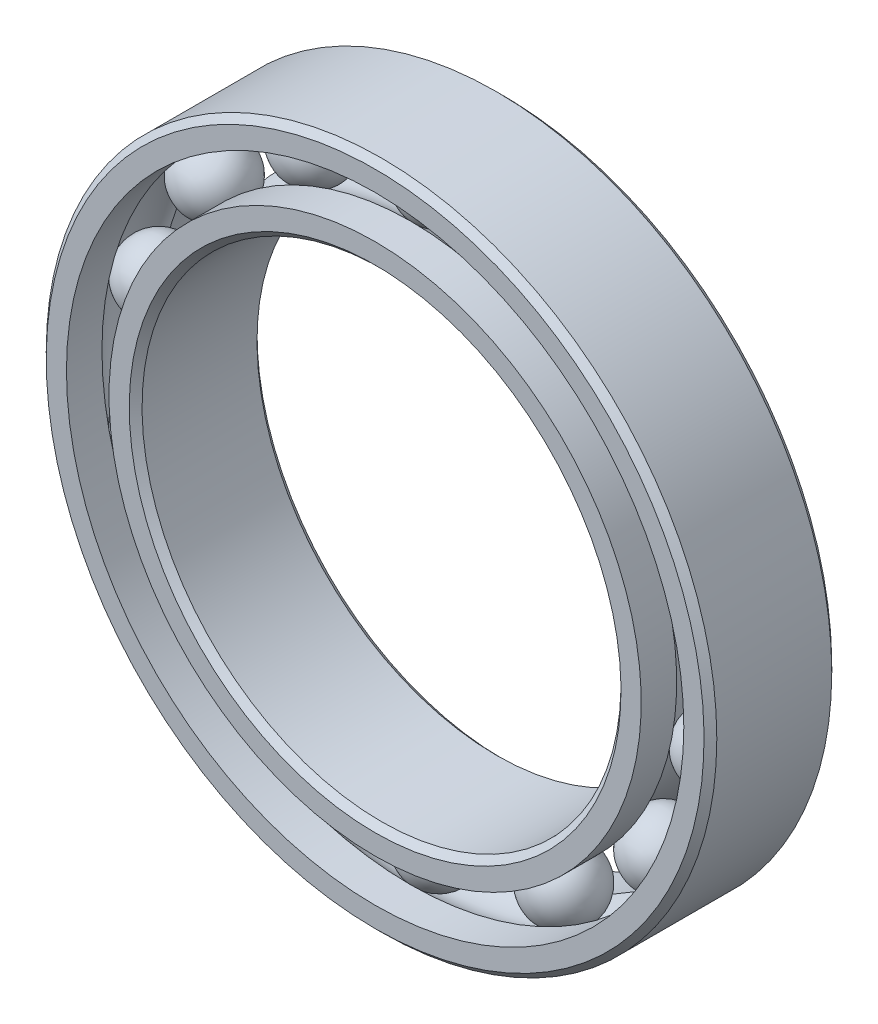
ISO-10303-21;
HEADER;
FILE_DESCRIPTION(('STEP AP214'),'2;1');
FILE_NAME('part.step','',(''),(''),'','','');
FILE_SCHEMA(('AUTOMOTIVE_DESIGN { 1 0 10303 214 1 1 1 1 }'));
ENDSEC;
DATA;
#1=APPLICATION_CONTEXT('core data for automotive mechanical design processes');
#2=APPLICATION_PROTOCOL_DEFINITION('international standard','automotive_design',2000,#1);
#3=PRODUCT_CONTEXT('',#1,'mechanical');
#4=PRODUCT('Part','Part','',(#3));
#5=PRODUCT_RELATED_PRODUCT_CATEGORY('part','',(#4));
#6=PRODUCT_DEFINITION_FORMATION('','',#4);
#7=PRODUCT_DEFINITION_CONTEXT('part definition',#1,'design');
#8=PRODUCT_DEFINITION('design','',#6,#7);
#9=PRODUCT_DEFINITION_SHAPE('','',#8);
#10=(LENGTH_UNIT() NAMED_UNIT(*) SI_UNIT(.MILLI.,.METRE.));
#11=(NAMED_UNIT(*) PLANE_ANGLE_UNIT() SI_UNIT($,.RADIAN.));
#12=(NAMED_UNIT(*) SI_UNIT($,.STERADIAN.) SOLID_ANGLE_UNIT());
#13=UNCERTAINTY_MEASURE_WITH_UNIT(LENGTH_MEASURE(1.E-05),#10,'distance_accuracy_value','');
#14=(GEOMETRIC_REPRESENTATION_CONTEXT(3) GLOBAL_UNCERTAINTY_ASSIGNED_CONTEXT((#13)) GLOBAL_UNIT_ASSIGNED_CONTEXT((#10,
#11,#12)) REPRESENTATION_CONTEXT('',''));
#15=CARTESIAN_POINT('',(0.,0.,0.));
#16=DIRECTION('',(0.,0.,1.));
#17=DIRECTION('',(1.,0.,0.));
#18=AXIS2_PLACEMENT_3D('',#15,#16,#17);
#19=CARTESIAN_POINT('',(3.90495365205792,8.10871981112182,0.));
#20=DIRECTION('',(0.,0.,1.));
#21=DIRECTION('',(0.433883739117546,0.900968867902425,0.));
#22=AXIS2_PLACEMENT_3D('',#19,#20,#21);
#23=SPHERICAL_SURFACE('',#22,1.11111111111111);
#24=CARTESIAN_POINT('',(3.90495365205792,8.10871981112182,1.11111111111111));
#25=VERTEX_POINT('',#24);
#26=VERTEX_LOOP('',#25);
#27=FACE_BOUND('',#26,.T.);
#28=ADVANCED_FACE('F48',(#27),#23,.T.);
#29=CLOSED_SHELL('',(#28));
#30=MANIFOLD_SOLID_BREP('B2',#29);
#31=CARTESIAN_POINT('',(7.0364833422122,5.61140821672869,0.));
#32=DIRECTION('',(0.,0.,1.));
#33=DIRECTION('',(0.781831482468022,0.623489801858743,0.));
#34=AXIS2_PLACEMENT_3D('',#31,#32,#33);
#35=SPHERICAL_SURFACE('',#34,1.11111111111111);
#36=CARTESIAN_POINT('',(7.0364833422122,5.61140821672869,1.11111111111111));
#37=VERTEX_POINT('',#36);
#38=VERTEX_LOOP('',#37);
#39=FACE_BOUND('',#38,.T.);
#40=ADVANCED_FACE('F67',(#39),#35,.T.);
#41=CLOSED_SHELL('',(#40));
#42=MANIFOLD_SOLID_BREP('B6',#41);
#43=CARTESIAN_POINT('',(8.77435120963639,2.00268840560692,0.));
#44=DIRECTION('',(0.,0.,1.));
#45=DIRECTION('',(0.974927912181821,0.222520933956325,0.));
#46=AXIS2_PLACEMENT_3D('',#43,#44,#45);
#47=SPHERICAL_SURFACE('',#46,1.11111111111111);
#48=CARTESIAN_POINT('',(8.77435120963639,2.00268840560692,1.11111111111111));
#49=VERTEX_POINT('',#48);
#50=VERTEX_LOOP('',#49);
#51=FACE_BOUND('',#50,.T.);
#52=ADVANCED_FACE('F86',(#51),#47,.T.);
#53=CLOSED_SHELL('',(#52));
#54=MANIFOLD_SOLID_BREP('B44',#53);
#55=CARTESIAN_POINT('',(8.77435120963643,-2.00268840560675,0.));
#56=DIRECTION('',(0.,0.,1.));
#57=DIRECTION('',(0.974927912181826,-0.222520933956305,0.));
#58=AXIS2_PLACEMENT_3D('',#55,#56,#57);
#59=SPHERICAL_SURFACE('',#58,1.11111111111111);
#60=CARTESIAN_POINT('',(8.77435120963643,-2.00268840560675,1.11111111111111));
#61=VERTEX_POINT('',#60);
#62=VERTEX_LOOP('',#61);
#63=FACE_BOUND('',#62,.T.);
#64=ADVANCED_FACE('F105',(#63),#59,.T.);
#65=CLOSED_SHELL('',(#64));
#66=MANIFOLD_SOLID_BREP('B63',#65);
#67=CARTESIAN_POINT('',(7.03648334221232,-5.61140821672854,0.));
#68=DIRECTION('',(0.,0.,1.));
#69=DIRECTION('',(0.781831482468035,-0.623489801858727,0.));
#70=AXIS2_PLACEMENT_3D('',#67,#68,#69);
#71=SPHERICAL_SURFACE('',#70,1.11111111111111);
#72=CARTESIAN_POINT('',(7.03648334221232,-5.61140821672854,1.11111111111111));
#73=VERTEX_POINT('',#72);
#74=VERTEX_LOOP('',#73);
#75=FACE_BOUND('',#74,.T.);
#76=ADVANCED_FACE('F124',(#75),#71,.T.);
#77=CLOSED_SHELL('',(#76));
#78=MANIFOLD_SOLID_BREP('B82',#77);
#79=CARTESIAN_POINT('',(3.90495365205809,-8.10871981112174,0.));
#80=DIRECTION('',(0.,0.,1.));
#81=DIRECTION('',(0.433883739117565,-0.900968867902416,0.));
#82=AXIS2_PLACEMENT_3D('',#79,#80,#81);
#83=SPHERICAL_SURFACE('',#82,1.11111111111111);
#84=CARTESIAN_POINT('',(3.90495365205809,-8.10871981112174,1.1111111111111));
#85=VERTEX_POINT('',#84);
#86=VERTEX_LOOP('',#85);
#87=FACE_BOUND('',#86,.T.);
#88=ADVANCED_FACE('F143',(#87),#83,.T.);
#89=CLOSED_SHELL('',(#88));
#90=MANIFOLD_SOLID_BREP('B101',#89);
#91=CARTESIAN_POINT('',(0.,-9.,0.));
#92=DIRECTION('',(0.,0.,1.));
#93=DIRECTION('',(0.,-1.,0.));
#94=AXIS2_PLACEMENT_3D('',#91,#92,#93);
#95=SPHERICAL_SURFACE('',#94,1.11111111111111);
#96=CARTESIAN_POINT('',(0.,-9.,1.1111111111111));
#97=VERTEX_POINT('',#96);
#98=VERTEX_LOOP('',#97);
#99=FACE_BOUND('',#98,.T.);
#100=ADVANCED_FACE('F162',(#99),#95,.T.);
#101=CLOSED_SHELL('',(#100));
#102=MANIFOLD_SOLID_BREP('B120',#101);
#103=CARTESIAN_POINT('',(-3.90495365205797,-8.1087198111218,0.));
#104=DIRECTION('',(0.,0.,1.));
#105=DIRECTION('',(-0.433883739117553,-0.900968867902422,0.));
#106=AXIS2_PLACEMENT_3D('',#103,#104,#105);
#107=SPHERICAL_SURFACE('',#106,1.11111111111111);
#108=CARTESIAN_POINT('',(-3.90495365205797,-8.1087198111218,1.1111111111111));
#109=VERTEX_POINT('',#108);
#110=VERTEX_LOOP('',#109);
#111=FACE_BOUND('',#110,.T.);
#112=ADVANCED_FACE('F181',(#111),#107,.T.);
#113=CLOSED_SHELL('',(#112));
#114=MANIFOLD_SOLID_BREP('B139',#113);
#115=CARTESIAN_POINT('',(-7.03648334221224,-5.61140821672864,0.));
#116=DIRECTION('',(0.,0.,1.));
#117=DIRECTION('',(-0.781831482468027,-0.623489801858737,0.));
#118=AXIS2_PLACEMENT_3D('',#115,#116,#117);
#119=SPHERICAL_SURFACE('',#118,1.11111111111111);
#120=CARTESIAN_POINT('',(-7.03648334221224,-5.61140821672864,1.11111111111111));
#121=VERTEX_POINT('',#120);
#122=VERTEX_LOOP('',#121);
#123=FACE_BOUND('',#122,.T.);
#124=ADVANCED_FACE('F200',(#123),#119,.T.);
#125=CLOSED_SHELL('',(#124));
#126=MANIFOLD_SOLID_BREP('B158',#125);
#127=CARTESIAN_POINT('',(-8.77435120963641,-2.00268840560686,0.));
#128=DIRECTION('',(0.,0.,1.));
#129=DIRECTION('',(-0.974927912181823,-0.222520933956318,0.));
#130=AXIS2_PLACEMENT_3D('',#127,#128,#129);
#131=SPHERICAL_SURFACE('',#130,1.11111111111111);
#132=CARTESIAN_POINT('',(-8.77435120963641,-2.00268840560686,1.11111111111111));
#133=VERTEX_POINT('',#132);
#134=VERTEX_LOOP('',#133);
#135=FACE_BOUND('',#134,.T.);
#136=ADVANCED_FACE('F219',(#135),#131,.T.);
#137=CLOSED_SHELL('',(#136));
#138=MANIFOLD_SOLID_BREP('B177',#137);
#139=CARTESIAN_POINT('',(-8.77435120963642,2.0026884056068,0.));
#140=DIRECTION('',(0.,0.,1.));
#141=DIRECTION('',(-0.974927912181824,0.222520933956311,0.));
#142=AXIS2_PLACEMENT_3D('',#139,#140,#141);
#143=SPHERICAL_SURFACE('',#142,1.11111111111111);
#144=CARTESIAN_POINT('',(-8.77435120963642,2.0026884056068,1.11111111111111));
#145=VERTEX_POINT('',#144);
#146=VERTEX_LOOP('',#145);
#147=FACE_BOUND('',#146,.T.);
#148=ADVANCED_FACE('F238',(#147),#143,.T.);
#149=CLOSED_SHELL('',(#148));
#150=MANIFOLD_SOLID_BREP('B196',#149);
#151=CARTESIAN_POINT('',(-7.03648334221228,5.61140821672859,0.));
#152=DIRECTION('',(0.,0.,1.));
#153=DIRECTION('',(-0.781831482468031,0.623489801858732,0.));
#154=AXIS2_PLACEMENT_3D('',#151,#152,#153);
#155=SPHERICAL_SURFACE('',#154,1.11111111111111);
#156=CARTESIAN_POINT('',(-7.03648334221228,5.61140821672859,1.11111111111111));
#157=VERTEX_POINT('',#156);
#158=VERTEX_LOOP('',#157);
#159=FACE_BOUND('',#158,.T.);
#160=ADVANCED_FACE('F257',(#159),#155,.T.);
#161=CLOSED_SHELL('',(#160));
#162=MANIFOLD_SOLID_BREP('B215',#161);
#163=CARTESIAN_POINT('',(-3.90495365205803,8.10871981112177,0.));
#164=DIRECTION('',(0.,0.,1.));
#165=DIRECTION('',(-0.433883739117559,0.900968867902419,0.));
#166=AXIS2_PLACEMENT_3D('',#163,#164,#165);
#167=SPHERICAL_SURFACE('',#166,1.11111111111111);
#168=CARTESIAN_POINT('',(-3.90495365205803,8.10871981112177,1.11111111111111));
#169=VERTEX_POINT('',#168);
#170=VERTEX_LOOP('',#169);
#171=FACE_BOUND('',#170,.T.);
#172=ADVANCED_FACE('F276',(#171),#167,.T.);
#173=CLOSED_SHELL('',(#172));
#174=MANIFOLD_SOLID_BREP('B234',#173);
#175=CARTESIAN_POINT('',(0.,9.,0.));
#176=DIRECTION('',(0.,0.,1.));
#177=DIRECTION('',(0.,1.,0.));
#178=AXIS2_PLACEMENT_3D('',#175,#176,#177);
#179=SPHERICAL_SURFACE('',#178,1.11111111111111);
#180=CARTESIAN_POINT('',(0.,9.,1.11111111111111));
#181=VERTEX_POINT('',#180);
#182=VERTEX_LOOP('',#181);
#183=FACE_BOUND('',#182,.T.);
#184=ADVANCED_FACE('F297',(#183),#179,.T.);
#185=CLOSED_SHELL('',(#184));
#186=MANIFOLD_SOLID_BREP('B253',#185);
#187=CARTESIAN_POINT('',(0.,8.33333333333335,2.));
#188=DIRECTION('',(0.,0.,-1.));
#189=DIRECTION('',(0.,1.,0.));
#190=AXIS2_PLACEMENT_3D('',#187,#188,#189);
#191=PLANE('',#190);
#192=CARTESIAN_POINT('',(0.,0.,2.));
#193=DIRECTION('',(0.,0.,1.));
#194=DIRECTION('',(0.,-1.,0.));
#195=AXIS2_PLACEMENT_3D('',#192,#193,#194);
#196=CIRCLE('',#195,7.7);
#197=CARTESIAN_POINT('',(0.,-7.7,2.));
#198=VERTEX_POINT('',#197);
#199=EDGE_CURVE('E354',#198,#198,#196,.T.);
#200=ORIENTED_EDGE('',*,*,#199,.F.);
#201=EDGE_LOOP('',(#200));
#202=FACE_BOUND('',#201,.T.);
#203=CARTESIAN_POINT('',(0.,0.,2.));
#204=DIRECTION('',(0.,0.,1.));
#205=DIRECTION('',(0.,-1.,0.));
#206=AXIS2_PLACEMENT_3D('',#203,#204,#205);
#207=CIRCLE('',#206,8.33333333333335);
#208=CARTESIAN_POINT('',(0.,-8.33333333333335,2.));
#209=VERTEX_POINT('',#208);
#210=EDGE_CURVE('E296',#209,#209,#207,.T.);
#211=ORIENTED_EDGE('',*,*,#210,.T.);
#212=EDGE_LOOP('',(#211));
#213=FACE_BOUND('',#212,.T.);
#214=ADVANCED_FACE('F317',(#202,#213),#191,.F.);
#215=CARTESIAN_POINT('',(0.,0.,1.99999999999999));
#216=DIRECTION('',(0.,0.,1.));
#217=DIRECTION('',(0.,-1.,0.));
#218=AXIS2_PLACEMENT_3D('',#215,#216,#217);
#219=CYLINDRICAL_SURFACE('',#218,8.33333333333335);
#220=ORIENTED_EDGE('',*,*,#210,.F.);
#221=EDGE_LOOP('',(#220));
#222=FACE_BOUND('',#221,.T.);
#223=CARTESIAN_POINT('',(0.,0.,0.888888888888882));
#224=DIRECTION('',(0.,0.,1.));
#225=DIRECTION('',(0.,-1.,0.));
#226=AXIS2_PLACEMENT_3D('',#223,#224,#225);
#227=CIRCLE('',#226,8.33333333333335);
#228=CARTESIAN_POINT('',(0.,-8.33333333333335,0.888888888888881));
#229=VERTEX_POINT('',#228);
#230=EDGE_CURVE('E324',#229,#229,#227,.T.);
#231=ORIENTED_EDGE('',*,*,#230,.T.);
#232=EDGE_LOOP('',(#231));
#233=FACE_BOUND('',#232,.T.);
#234=ADVANCED_FACE('F363',(#222,#233),#219,.T.);
#235=CARTESIAN_POINT('',(0.,0.,0.));
#236=DIRECTION('',(0.,0.,1.));
#237=DIRECTION('',(0.,-1.,0.));
#238=AXIS2_PLACEMENT_3D('',#235,#236,#237);
#239=TOROIDAL_SURFACE('',#238,9.00000000000003,1.11111111111111);
#240=ORIENTED_EDGE('',*,*,#230,.F.);
#241=EDGE_LOOP('',(#240));
#242=FACE_BOUND('',#241,.T.);
#243=CARTESIAN_POINT('',(0.,0.,-0.888888888888884));
#244=DIRECTION('',(0.,0.,1.));
#245=DIRECTION('',(0.,-1.,0.));
#246=AXIS2_PLACEMENT_3D('',#243,#244,#245);
#247=CIRCLE('',#246,8.33333333333335);
#248=CARTESIAN_POINT('',(0.,-8.33333333333335,-0.888888888888885));
#249=VERTEX_POINT('',#248);
#250=EDGE_CURVE('E330',#249,#249,#247,.T.);
#251=ORIENTED_EDGE('',*,*,#250,.T.);
#252=EDGE_LOOP('',(#251));
#253=FACE_BOUND('',#252,.T.);
#254=ADVANCED_FACE('F367',(#242,#253),#239,.F.);
#255=CARTESIAN_POINT('',(0.,0.,1.99999999999999));
#256=DIRECTION('',(0.,0.,1.));
#257=DIRECTION('',(0.,-1.,0.));
#258=AXIS2_PLACEMENT_3D('',#255,#256,#257);
#259=CYLINDRICAL_SURFACE('',#258,8.33333333333335);
#260=ORIENTED_EDGE('',*,*,#250,.F.);
#261=EDGE_LOOP('',(#260));
#262=FACE_BOUND('',#261,.T.);
#263=CARTESIAN_POINT('',(0.,0.,-2.));
#264=DIRECTION('',(0.,0.,1.));
#265=DIRECTION('',(0.,-1.,0.));
#266=AXIS2_PLACEMENT_3D('',#263,#264,#265);
#267=CIRCLE('',#266,8.33333333333335);
#268=CARTESIAN_POINT('',(0.,-8.33333333333335,-2.00000000000001));
#269=VERTEX_POINT('',#268);
#270=EDGE_CURVE('E336',#269,#269,#267,.T.);
#271=ORIENTED_EDGE('',*,*,#270,.T.);
#272=EDGE_LOOP('',(#271));
#273=FACE_BOUND('',#272,.T.);
#274=ADVANCED_FACE('F372',(#262,#273),#259,.T.);
#275=CARTESIAN_POINT('',(0.,7.69999999999999,-2.00000000000001));
#276=DIRECTION('',(0.,0.,1.));
#277=DIRECTION('',(0.,-1.,0.));
#278=AXIS2_PLACEMENT_3D('',#275,#276,#277);
#279=PLANE('',#278);
#280=ORIENTED_EDGE('',*,*,#270,.F.);
#281=EDGE_LOOP('',(#280));
#282=FACE_BOUND('',#281,.T.);
#283=CARTESIAN_POINT('',(0.,0.,-2.00000000000001));
#284=DIRECTION('',(0.,0.,1.));
#285=DIRECTION('',(0.,-1.,0.));
#286=AXIS2_PLACEMENT_3D('',#283,#284,#285);
#287=CIRCLE('',#286,7.69999999999999);
#288=CARTESIAN_POINT('',(0.,-7.69999999999999,-2.00000000000001));
#289=VERTEX_POINT('',#288);
#290=EDGE_CURVE('E342',#289,#289,#287,.T.);
#291=ORIENTED_EDGE('',*,*,#290,.T.);
#292=EDGE_LOOP('',(#291));
#293=FACE_BOUND('',#292,.T.);
#294=ADVANCED_FACE('F378',(#282,#293),#279,.F.);
#295=CARTESIAN_POINT('',(0.,0.,-1.80000000000001));
#296=DIRECTION('',(0.,0.,-1.));
#297=DIRECTION('',(0.,1.,0.));
#298=AXIS2_PLACEMENT_3D('',#295,#296,#297);
#299=CONICAL_SURFACE('',#298,7.50000000000001,0.785398163397401);
#300=ORIENTED_EDGE('',*,*,#290,.F.);
#301=EDGE_LOOP('',(#300));
#302=FACE_BOUND('',#301,.T.);
#303=CARTESIAN_POINT('',(0.,0.,-1.80000000000001));
#304=DIRECTION('',(0.,0.,1.));
#305=DIRECTION('',(0.,-1.,0.));
#306=AXIS2_PLACEMENT_3D('',#303,#304,#305);
#307=CIRCLE('',#306,7.50000000000001);
#308=CARTESIAN_POINT('',(0.,-7.50000000000001,-1.80000000000001));
#309=VERTEX_POINT('',#308);
#310=EDGE_CURVE('E346',#309,#309,#307,.T.);
#311=ORIENTED_EDGE('',*,*,#310,.T.);
#312=EDGE_LOOP('',(#311));
#313=FACE_BOUND('',#312,.T.);
#314=ADVANCED_FACE('F382',(#302,#313),#299,.F.);
#315=CARTESIAN_POINT('',(0.,0.,1.99999999999999));
#316=DIRECTION('',(0.,0.,1.));
#317=DIRECTION('',(0.,-1.,0.));
#318=AXIS2_PLACEMENT_3D('',#315,#316,#317);
#319=CYLINDRICAL_SURFACE('',#318,7.50000000000001);
#320=ORIENTED_EDGE('',*,*,#310,.F.);
#321=EDGE_LOOP('',(#320));
#322=FACE_BOUND('',#321,.T.);
#323=CARTESIAN_POINT('',(0.,0.,1.80000000000002));
#324=DIRECTION('',(0.,0.,1.));
#325=DIRECTION('',(0.,-1.,0.));
#326=AXIS2_PLACEMENT_3D('',#323,#324,#325);
#327=CIRCLE('',#326,7.5);
#328=CARTESIAN_POINT('',(0.,-7.5,1.80000000000002));
#329=VERTEX_POINT('',#328);
#330=EDGE_CURVE('E350',#329,#329,#327,.T.);
#331=ORIENTED_EDGE('',*,*,#330,.T.);
#332=EDGE_LOOP('',(#331));
#333=FACE_BOUND('',#332,.T.);
#334=ADVANCED_FACE('F386',(#322,#333),#319,.F.);
#335=CARTESIAN_POINT('',(0.,0.,2.));
#336=DIRECTION('',(0.,0.,1.));
#337=DIRECTION('',(0.,-1.,0.));
#338=AXIS2_PLACEMENT_3D('',#335,#336,#337);
#339=CONICAL_SURFACE('',#338,7.7,0.785398163397505);
#340=ORIENTED_EDGE('',*,*,#330,.F.);
#341=EDGE_LOOP('',(#340));
#342=FACE_BOUND('',#341,.T.);
#343=ORIENTED_EDGE('',*,*,#199,.T.);
#344=EDGE_LOOP('',(#343));
#345=FACE_BOUND('',#344,.T.);
#346=ADVANCED_FACE('F360',(#342,#345),#339,.F.);
#347=CLOSED_SHELL('',(#214,#234,#254,#274,#294,#314,#334,#346));
#348=MANIFOLD_SOLID_BREP('B272',#347);
#349=CARTESIAN_POINT('',(0.,0.,1.99999999999999));
#350=DIRECTION('',(0.,0.,1.));
#351=DIRECTION('',(0.,-1.,0.));
#352=AXIS2_PLACEMENT_3D('',#349,#350,#351);
#353=CYLINDRICAL_SURFACE('',#352,10.5);
#354=CARTESIAN_POINT('',(0.,0.,1.8));
#355=DIRECTION('',(0.,0.,1.));
#356=DIRECTION('',(0.,-1.,0.));
#357=AXIS2_PLACEMENT_3D('',#354,#355,#356);
#358=CIRCLE('',#357,10.5);
#359=CARTESIAN_POINT('',(0.,-10.5,1.8));
#360=VERTEX_POINT('',#359);
#361=EDGE_CURVE('E316',#360,#360,#358,.T.);
#362=ORIENTED_EDGE('',*,*,#361,.F.);
#363=EDGE_LOOP('',(#362));
#364=FACE_BOUND('',#363,.T.);
#365=CARTESIAN_POINT('',(0.,0.,-1.80000000000001));
#366=DIRECTION('',(0.,0.,1.));
#367=DIRECTION('',(0.,-1.,0.));
#368=AXIS2_PLACEMENT_3D('',#365,#366,#367);
#369=CIRCLE('',#368,10.5);
#370=CARTESIAN_POINT('',(0.,-10.5,-1.80000000000001));
#371=VERTEX_POINT('',#370);
#372=EDGE_CURVE('E492',#371,#371,#369,.T.);
#373=ORIENTED_EDGE('',*,*,#372,.T.);
#374=EDGE_LOOP('',(#373));
#375=FACE_BOUND('',#374,.T.);
#376=ADVANCED_FACE('F455',(#364,#375),#353,.T.);
#377=CARTESIAN_POINT('',(0.,0.,1.8));
#378=DIRECTION('',(0.,0.,-1.));
#379=DIRECTION('',(0.,1.,0.));
#380=AXIS2_PLACEMENT_3D('',#377,#378,#379);
#381=CONICAL_SURFACE('',#380,10.5,0.785398163397407);
#382=CARTESIAN_POINT('',(0.,0.,1.99999999999999));
#383=DIRECTION('',(0.,0.,1.));
#384=DIRECTION('',(0.,-1.,0.));
#385=AXIS2_PLACEMENT_3D('',#382,#383,#384);
#386=CIRCLE('',#385,10.3);
#387=CARTESIAN_POINT('',(0.,-10.3,1.99999999999999));
#388=VERTEX_POINT('',#387);
#389=EDGE_CURVE('E462',#388,#388,#386,.T.);
#390=ORIENTED_EDGE('',*,*,#389,.F.);
#391=EDGE_LOOP('',(#390));
#392=FACE_BOUND('',#391,.T.);
#393=ORIENTED_EDGE('',*,*,#361,.T.);
#394=EDGE_LOOP('',(#393));
#395=FACE_BOUND('',#394,.T.);
#396=ADVANCED_FACE('F531',(#392,#395),#381,.T.);
#397=CARTESIAN_POINT('',(0.,10.3,1.99999999999999));
#398=DIRECTION('',(0.,0.,-1.));
#399=DIRECTION('',(0.,1.,0.));
#400=AXIS2_PLACEMENT_3D('',#397,#398,#399);
#401=PLANE('',#400);
#402=CARTESIAN_POINT('',(0.,0.,1.99999999999999));
#403=DIRECTION('',(0.,0.,1.));
#404=DIRECTION('',(0.,-1.,0.));
#405=AXIS2_PLACEMENT_3D('',#402,#403,#404);
#406=CIRCLE('',#405,9.66666666666667);
#407=CARTESIAN_POINT('',(0.,-9.66666666666667,1.99999999999999));
#408=VERTEX_POINT('',#407);
#409=EDGE_CURVE('E468',#408,#408,#406,.T.);
#410=ORIENTED_EDGE('',*,*,#409,.F.);
#411=EDGE_LOOP('',(#410));
#412=FACE_BOUND('',#411,.T.);
#413=ORIENTED_EDGE('',*,*,#389,.T.);
#414=EDGE_LOOP('',(#413));
#415=FACE_BOUND('',#414,.T.);
#416=ADVANCED_FACE('F526',(#412,#415),#401,.F.);
#417=CARTESIAN_POINT('',(0.,0.,1.99999999999999));
#418=DIRECTION('',(0.,0.,1.));
#419=DIRECTION('',(0.,-1.,0.));
#420=AXIS2_PLACEMENT_3D('',#417,#418,#419);
#421=CYLINDRICAL_SURFACE('',#420,9.66666666666667);
#422=CARTESIAN_POINT('',(0.,0.,0.888888888888882));
#423=DIRECTION('',(0.,0.,1.));
#424=DIRECTION('',(0.,-1.,0.));
#425=AXIS2_PLACEMENT_3D('',#422,#423,#424);
#426=CIRCLE('',#425,9.66666666666667);
#427=CARTESIAN_POINT('',(0.,-9.66666666666667,0.888888888888881));
#428=VERTEX_POINT('',#427);
#429=EDGE_CURVE('E474',#428,#428,#426,.T.);
#430=ORIENTED_EDGE('',*,*,#429,.F.);
#431=EDGE_LOOP('',(#430));
#432=FACE_BOUND('',#431,.T.);
#433=ORIENTED_EDGE('',*,*,#409,.T.);
#434=EDGE_LOOP('',(#433));
#435=FACE_BOUND('',#434,.T.);
#436=ADVANCED_FACE('F520',(#432,#435),#421,.F.);
#437=CARTESIAN_POINT('',(0.,0.,0.));
#438=DIRECTION('',(0.,0.,1.));
#439=DIRECTION('',(0.,-1.,0.));
#440=AXIS2_PLACEMENT_3D('',#437,#438,#439);
#441=TOROIDAL_SURFACE('',#440,9.,1.11111111111111);
#442=CARTESIAN_POINT('',(0.,0.,-0.888888888888897));
#443=DIRECTION('',(0.,0.,1.));
#444=DIRECTION('',(0.,-1.,0.));
#445=AXIS2_PLACEMENT_3D('',#442,#443,#444);
#446=CIRCLE('',#445,9.66666666666667);
#447=CARTESIAN_POINT('',(0.,-9.66666666666667,-0.888888888888898));
#448=VERTEX_POINT('',#447);
#449=EDGE_CURVE('E480',#448,#448,#446,.T.);
#450=ORIENTED_EDGE('',*,*,#449,.F.);
#451=EDGE_LOOP('',(#450));
#452=FACE_BOUND('',#451,.T.);
#453=ORIENTED_EDGE('',*,*,#429,.T.);
#454=EDGE_LOOP('',(#453));
#455=FACE_BOUND('',#454,.T.);
#456=ADVANCED_FACE('F514',(#452,#455),#441,.F.);
#457=CARTESIAN_POINT('',(0.,0.,1.99999999999999));
#458=DIRECTION('',(0.,0.,1.));
#459=DIRECTION('',(0.,-1.,0.));
#460=AXIS2_PLACEMENT_3D('',#457,#458,#459);
#461=CYLINDRICAL_SURFACE('',#460,9.66666666666667);
#462=CARTESIAN_POINT('',(0.,0.,-2.00000000000001));
#463=DIRECTION('',(0.,0.,1.));
#464=DIRECTION('',(0.,-1.,0.));
#465=AXIS2_PLACEMENT_3D('',#462,#463,#464);
#466=CIRCLE('',#465,9.66666666666667);
#467=CARTESIAN_POINT('',(0.,-9.66666666666667,-2.00000000000001));
#468=VERTEX_POINT('',#467);
#469=EDGE_CURVE('E484',#468,#468,#466,.T.);
#470=ORIENTED_EDGE('',*,*,#469,.F.);
#471=EDGE_LOOP('',(#470));
#472=FACE_BOUND('',#471,.T.);
#473=ORIENTED_EDGE('',*,*,#449,.T.);
#474=EDGE_LOOP('',(#473));
#475=FACE_BOUND('',#474,.T.);
#476=ADVANCED_FACE('F508',(#472,#475),#461,.F.);
#477=CARTESIAN_POINT('',(0.,10.3,-2.00000000000001));
#478=DIRECTION('',(0.,0.,1.));
#479=DIRECTION('',(0.,-1.,0.));
#480=AXIS2_PLACEMENT_3D('',#477,#478,#479);
#481=PLANE('',#480);
#482=CARTESIAN_POINT('',(0.,0.,-2.00000000000001));
#483=DIRECTION('',(0.,0.,1.));
#484=DIRECTION('',(0.,-1.,0.));
#485=AXIS2_PLACEMENT_3D('',#482,#483,#484);
#486=CIRCLE('',#485,10.3);
#487=CARTESIAN_POINT('',(0.,-10.3,-2.00000000000001));
#488=VERTEX_POINT('',#487);
#489=EDGE_CURVE('E488',#488,#488,#486,.T.);
#490=ORIENTED_EDGE('',*,*,#489,.F.);
#491=EDGE_LOOP('',(#490));
#492=FACE_BOUND('',#491,.T.);
#493=ORIENTED_EDGE('',*,*,#469,.T.);
#494=EDGE_LOOP('',(#493));
#495=FACE_BOUND('',#494,.T.);
#496=ADVANCED_FACE('F502',(#492,#495),#481,.F.);
#497=CARTESIAN_POINT('',(0.,0.,-2.00000000000001));
#498=DIRECTION('',(0.,0.,1.));
#499=DIRECTION('',(0.,-1.,0.));
#500=AXIS2_PLACEMENT_3D('',#497,#498,#499);
#501=CONICAL_SURFACE('',#500,10.3,0.785398163397408);
#502=ORIENTED_EDGE('',*,*,#372,.F.);
#503=EDGE_LOOP('',(#502));
#504=FACE_BOUND('',#503,.T.);
#505=ORIENTED_EDGE('',*,*,#489,.T.);
#506=EDGE_LOOP('',(#505));
#507=FACE_BOUND('',#506,.T.);
#508=ADVANCED_FACE('F499',(#504,#507),#501,.T.);
#509=CLOSED_SHELL('',(#376,#396,#416,#436,#456,#476,#496,#508));
#510=MANIFOLD_SOLID_BREP('B291',#509);
#511=ADVANCED_BREP_SHAPE_REPRESENTATION('',(#18,#30,#42,#54,#66,#78,#90,#102,#114,#126,#138,
#150,#162,#174,#186,#348,#510),#14);
#512=SHAPE_DEFINITION_REPRESENTATION(#9,#511);
ENDSEC;
END-ISO-10303-21;
